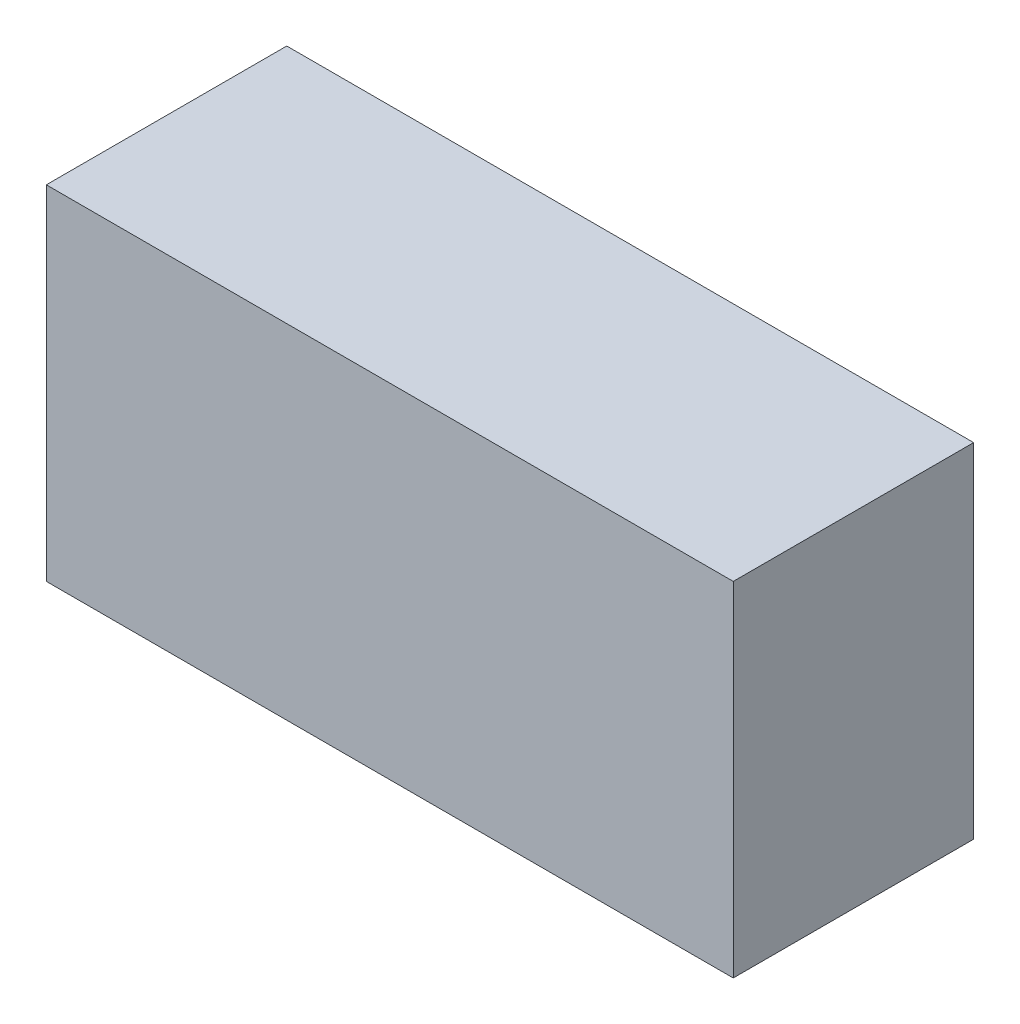
ISO-10303-21;
HEADER;
FILE_DESCRIPTION(('STEP AP214'),'2;1');
FILE_NAME('part.step','',(''),(''),'','','');
FILE_SCHEMA(('AUTOMOTIVE_DESIGN { 1 0 10303 214 1 1 1 1 }'));
ENDSEC;
DATA;
#1=APPLICATION_CONTEXT('core data for automotive mechanical design processes');
#2=APPLICATION_PROTOCOL_DEFINITION('international standard','automotive_design',2000,#1);
#3=PRODUCT_CONTEXT('',#1,'mechanical');
#4=PRODUCT('Part','Part','',(#3));
#5=PRODUCT_RELATED_PRODUCT_CATEGORY('part','',(#4));
#6=PRODUCT_DEFINITION_FORMATION('','',#4);
#7=PRODUCT_DEFINITION_CONTEXT('part definition',#1,'design');
#8=PRODUCT_DEFINITION('design','',#6,#7);
#9=PRODUCT_DEFINITION_SHAPE('','',#8);
#10=(LENGTH_UNIT() NAMED_UNIT(*) SI_UNIT(.MILLI.,.METRE.));
#11=(NAMED_UNIT(*) PLANE_ANGLE_UNIT() SI_UNIT($,.RADIAN.));
#12=(NAMED_UNIT(*) SI_UNIT($,.STERADIAN.) SOLID_ANGLE_UNIT());
#13=UNCERTAINTY_MEASURE_WITH_UNIT(LENGTH_MEASURE(1.E-05),#10,'distance_accuracy_value','');
#14=(GEOMETRIC_REPRESENTATION_CONTEXT(3) GLOBAL_UNCERTAINTY_ASSIGNED_CONTEXT((#13)) GLOBAL_UNIT_ASSIGNED_CONTEXT((#10,
#11,#12)) REPRESENTATION_CONTEXT('',''));
#15=CARTESIAN_POINT('',(0.,0.,0.));
#16=DIRECTION('',(0.,0.,1.));
#17=DIRECTION('',(1.,0.,0.));
#18=AXIS2_PLACEMENT_3D('',#15,#16,#17);
#19=CARTESIAN_POINT('',(30.,-15.,21.));
#20=DIRECTION('',(-1.,0.,0.));
#21=DIRECTION('',(0.,0.,1.));
#22=AXIS2_PLACEMENT_3D('',#19,#20,#21);
#23=PLANE('',#22);
#24=DIRECTION('',(0.,1.,0.));
#25=VECTOR('',#24,1.);
#26=CARTESIAN_POINT('',(30.,-15.,0.));
#27=LINE('',#26,#25);
#28=CARTESIAN_POINT('',(30.,-15.,0.));
#29=VERTEX_POINT('',#28);
#30=CARTESIAN_POINT('',(30.,15.,0.));
#31=VERTEX_POINT('',#30);
#32=EDGE_CURVE('E104',#29,#31,#27,.T.);
#33=ORIENTED_EDGE('',*,*,#32,.T.);
#34=DIRECTION('',(0.,0.,-1.));
#35=VECTOR('',#34,1.);
#36=CARTESIAN_POINT('',(30.,15.,21.));
#37=LINE('',#36,#35);
#38=CARTESIAN_POINT('',(30.,15.,21.));
#39=VERTEX_POINT('',#38);
#40=EDGE_CURVE('E11',#39,#31,#37,.T.);
#41=ORIENTED_EDGE('',*,*,#40,.F.);
#42=DIRECTION('',(0.,1.,0.));
#43=VECTOR('',#42,1.);
#44=CARTESIAN_POINT('',(30.,-15.,21.));
#45=LINE('',#44,#43);
#46=CARTESIAN_POINT('',(30.,-15.,21.));
#47=VERTEX_POINT('',#46);
#48=EDGE_CURVE('E92',#47,#39,#45,.T.);
#49=ORIENTED_EDGE('',*,*,#48,.F.);
#50=DIRECTION('',(0.,0.,-1.));
#51=VECTOR('',#50,1.);
#52=CARTESIAN_POINT('',(30.,-15.,21.));
#53=LINE('',#52,#51);
#54=EDGE_CURVE('E100',#47,#29,#53,.T.);
#55=ORIENTED_EDGE('',*,*,#54,.T.);
#56=EDGE_LOOP('',(#33,#41,#49,#55));
#57=FACE_BOUND('',#56,.T.);
#58=ADVANCED_FACE('F41',(#57),#23,.F.);
#59=CARTESIAN_POINT('',(-30.,15.,21.));
#60=DIRECTION('',(0.,-1.,0.));
#61=DIRECTION('',(0.,0.,-1.));
#62=AXIS2_PLACEMENT_3D('',#59,#60,#61);
#63=PLANE('',#62);
#64=DIRECTION('',(-1.,0.,0.));
#65=VECTOR('',#64,1.);
#66=CARTESIAN_POINT('',(-30.,15.,0.));
#67=LINE('',#66,#65);
#68=CARTESIAN_POINT('',(-30.,15.,0.));
#69=VERTEX_POINT('',#68);
#70=EDGE_CURVE('E96',#31,#69,#67,.T.);
#71=ORIENTED_EDGE('',*,*,#70,.T.);
#72=DIRECTION('',(0.,0.,-1.));
#73=VECTOR('',#72,1.);
#74=CARTESIAN_POINT('',(-30.,15.,21.));
#75=LINE('',#74,#73);
#76=CARTESIAN_POINT('',(-30.,15.,21.));
#77=VERTEX_POINT('',#76);
#78=EDGE_CURVE('E49',#77,#69,#75,.T.);
#79=ORIENTED_EDGE('',*,*,#78,.F.);
#80=DIRECTION('',(-1.,0.,0.));
#81=VECTOR('',#80,1.);
#82=CARTESIAN_POINT('',(-30.,15.,21.));
#83=LINE('',#82,#81);
#84=EDGE_CURVE('E87',#39,#77,#83,.T.);
#85=ORIENTED_EDGE('',*,*,#84,.F.);
#86=ORIENTED_EDGE('',*,*,#40,.T.);
#87=EDGE_LOOP('',(#71,#79,#85,#86));
#88=FACE_BOUND('',#87,.T.);
#89=ADVANCED_FACE('F95',(#88),#63,.F.);
#90=CARTESIAN_POINT('',(-30.,-15.,21.));
#91=DIRECTION('',(1.,0.,0.));
#92=DIRECTION('',(0.,0.,-1.));
#93=AXIS2_PLACEMENT_3D('',#90,#91,#92);
#94=PLANE('',#93);
#95=DIRECTION('',(0.,-1.,0.));
#96=VECTOR('',#95,1.);
#97=CARTESIAN_POINT('',(-30.,-15.,0.));
#98=LINE('',#97,#96);
#99=CARTESIAN_POINT('',(-30.,-15.,0.));
#100=VERTEX_POINT('',#99);
#101=EDGE_CURVE('E74',#69,#100,#98,.T.);
#102=ORIENTED_EDGE('',*,*,#101,.T.);
#103=DIRECTION('',(0.,0.,-1.));
#104=VECTOR('',#103,1.);
#105=CARTESIAN_POINT('',(-30.,-15.,21.));
#106=LINE('',#105,#104);
#107=CARTESIAN_POINT('',(-30.,-15.,21.));
#108=VERTEX_POINT('',#107);
#109=EDGE_CURVE('E97',#108,#100,#106,.T.);
#110=ORIENTED_EDGE('',*,*,#109,.F.);
#111=DIRECTION('',(0.,-1.,0.));
#112=VECTOR('',#111,1.);
#113=CARTESIAN_POINT('',(-30.,-15.,21.));
#114=LINE('',#113,#112);
#115=EDGE_CURVE('E90',#77,#108,#114,.T.);
#116=ORIENTED_EDGE('',*,*,#115,.F.);
#117=ORIENTED_EDGE('',*,*,#78,.T.);
#118=EDGE_LOOP('',(#102,#110,#116,#117));
#119=FACE_BOUND('',#118,.T.);
#120=ADVANCED_FACE('F98',(#119),#94,.F.);
#121=CARTESIAN_POINT('',(-30.,-15.,21.));
#122=DIRECTION('',(0.,1.,0.));
#123=DIRECTION('',(0.,0.,1.));
#124=AXIS2_PLACEMENT_3D('',#121,#122,#123);
#125=PLANE('',#124);
#126=DIRECTION('',(1.,0.,0.));
#127=VECTOR('',#126,1.);
#128=CARTESIAN_POINT('',(-30.,-15.,0.));
#129=LINE('',#128,#127);
#130=EDGE_CURVE('E80',#100,#29,#129,.T.);
#131=ORIENTED_EDGE('',*,*,#130,.T.);
#132=ORIENTED_EDGE('',*,*,#54,.F.);
#133=DIRECTION('',(1.,0.,0.));
#134=VECTOR('',#133,1.);
#135=CARTESIAN_POINT('',(-30.,-15.,21.));
#136=LINE('',#135,#134);
#137=EDGE_CURVE('E57',#108,#47,#136,.T.);
#138=ORIENTED_EDGE('',*,*,#137,.F.);
#139=ORIENTED_EDGE('',*,*,#109,.T.);
#140=EDGE_LOOP('',(#131,#132,#138,#139));
#141=FACE_BOUND('',#140,.T.);
#142=ADVANCED_FACE('F111',(#141),#125,.F.);
#143=CARTESIAN_POINT('',(0.,0.,21.));
#144=DIRECTION('',(0.,0.,-1.));
#145=DIRECTION('',(-1.,0.,0.));
#146=AXIS2_PLACEMENT_3D('',#143,#144,#145);
#147=PLANE('',#146);
#148=ORIENTED_EDGE('',*,*,#48,.T.);
#149=ORIENTED_EDGE('',*,*,#84,.T.);
#150=ORIENTED_EDGE('',*,*,#115,.T.);
#151=ORIENTED_EDGE('',*,*,#137,.T.);
#152=EDGE_LOOP('',(#148,#149,#150,#151));
#153=FACE_BOUND('',#152,.T.);
#154=ADVANCED_FACE('F88',(#153),#147,.F.);
#155=CARTESIAN_POINT('',(0.,0.,0.));
#156=DIRECTION('',(0.,0.,-1.));
#157=DIRECTION('',(-1.,0.,0.));
#158=AXIS2_PLACEMENT_3D('',#155,#156,#157);
#159=PLANE('',#158);
#160=ORIENTED_EDGE('',*,*,#32,.F.);
#161=ORIENTED_EDGE('',*,*,#130,.F.);
#162=ORIENTED_EDGE('',*,*,#101,.F.);
#163=ORIENTED_EDGE('',*,*,#70,.F.);
#164=EDGE_LOOP('',(#160,#161,#162,#163));
#165=FACE_BOUND('',#164,.T.);
#166=ADVANCED_FACE('F114',(#165),#159,.T.);
#167=CLOSED_SHELL('',(#58,#89,#120,#142,#154,#166));
#168=MANIFOLD_SOLID_BREP('B2',#167);
#169=ADVANCED_BREP_SHAPE_REPRESENTATION('',(#18,#168),#14);
#170=SHAPE_DEFINITION_REPRESENTATION(#9,#169);
ENDSEC;
END-ISO-10303-21;
